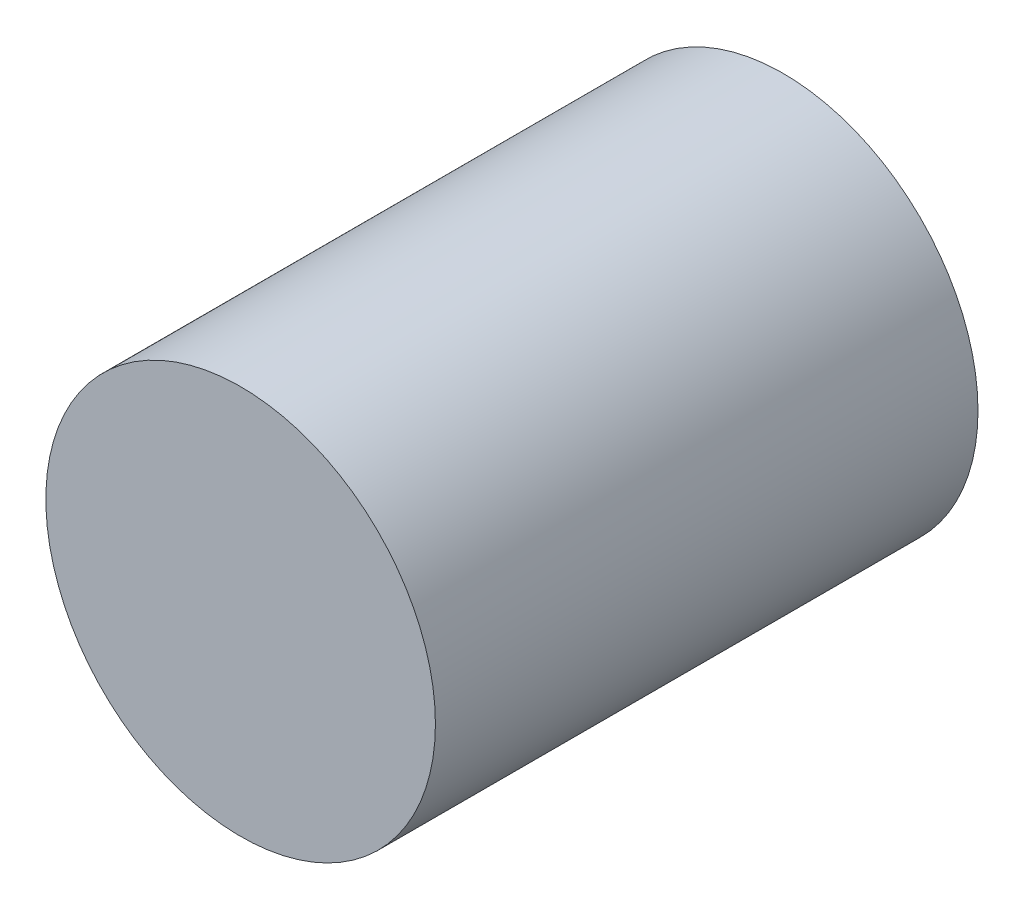
ISO-10303-21;
HEADER;
FILE_DESCRIPTION(('STEP AP214'),'2;1');
FILE_NAME('part.step','',(''),(''),'','','');
FILE_SCHEMA(('AUTOMOTIVE_DESIGN { 1 0 10303 214 1 1 1 1 }'));
ENDSEC;
DATA;
#1=APPLICATION_CONTEXT('core data for automotive mechanical design processes');
#2=APPLICATION_PROTOCOL_DEFINITION('international standard','automotive_design',2000,#1);
#3=PRODUCT_CONTEXT('',#1,'mechanical');
#4=PRODUCT('Part','Part','',(#3));
#5=PRODUCT_RELATED_PRODUCT_CATEGORY('part','',(#4));
#6=PRODUCT_DEFINITION_FORMATION('','',#4);
#7=PRODUCT_DEFINITION_CONTEXT('part definition',#1,'design');
#8=PRODUCT_DEFINITION('design','',#6,#7);
#9=PRODUCT_DEFINITION_SHAPE('','',#8);
#10=(LENGTH_UNIT() NAMED_UNIT(*) SI_UNIT(.MILLI.,.METRE.));
#11=(NAMED_UNIT(*) PLANE_ANGLE_UNIT() SI_UNIT($,.RADIAN.));
#12=(NAMED_UNIT(*) SI_UNIT($,.STERADIAN.) SOLID_ANGLE_UNIT());
#13=UNCERTAINTY_MEASURE_WITH_UNIT(LENGTH_MEASURE(1.E-05),#10,'distance_accuracy_value','');
#14=(GEOMETRIC_REPRESENTATION_CONTEXT(3) GLOBAL_UNCERTAINTY_ASSIGNED_CONTEXT((#13)) GLOBAL_UNIT_ASSIGNED_CONTEXT((#10,
#11,#12)) REPRESENTATION_CONTEXT('',''));
#15=CARTESIAN_POINT('',(0.,0.,0.));
#16=DIRECTION('',(0.,0.,1.));
#17=DIRECTION('',(1.,0.,0.));
#18=AXIS2_PLACEMENT_3D('',#15,#16,#17);
#19=CARTESIAN_POINT('',(0.,0.,20.));
#20=DIRECTION('',(0.,0.,-1.));
#21=DIRECTION('',(-1.,0.,0.));
#22=AXIS2_PLACEMENT_3D('',#19,#20,#21);
#23=CYLINDRICAL_SURFACE('',#22,7.18);
#24=CARTESIAN_POINT('',(0.,0.,20.));
#25=DIRECTION('',(0.,0.,1.));
#26=DIRECTION('',(1.,0.,0.));
#27=AXIS2_PLACEMENT_3D('',#24,#25,#26);
#28=CIRCLE('',#27,7.18);
#29=CARTESIAN_POINT('',(7.18,0.,20.));
#30=VERTEX_POINT('',#29);
#31=EDGE_CURVE('E10',#30,#30,#28,.T.);
#32=ORIENTED_EDGE('',*,*,#31,.F.);
#33=EDGE_LOOP('',(#32));
#34=FACE_BOUND('',#33,.T.);
#35=CARTESIAN_POINT('',(0.,0.,0.));
#36=DIRECTION('',(0.,0.,1.));
#37=DIRECTION('',(1.,0.,0.));
#38=AXIS2_PLACEMENT_3D('',#35,#36,#37);
#39=CIRCLE('',#38,7.18);
#40=CARTESIAN_POINT('',(7.18,0.,0.));
#41=VERTEX_POINT('',#40);
#42=EDGE_CURVE('E37',#41,#41,#39,.T.);
#43=ORIENTED_EDGE('',*,*,#42,.T.);
#44=EDGE_LOOP('',(#43));
#45=FACE_BOUND('',#44,.T.);
#46=ADVANCED_FACE('F40',(#34,#45),#23,.T.);
#47=CARTESIAN_POINT('',(0.,0.,20.));
#48=DIRECTION('',(0.,0.,1.));
#49=DIRECTION('',(1.,0.,0.));
#50=AXIS2_PLACEMENT_3D('',#47,#48,#49);
#51=PLANE('',#50);
#52=ORIENTED_EDGE('',*,*,#31,.T.);
#53=EDGE_LOOP('',(#52));
#54=FACE_BOUND('',#53,.T.);
#55=ADVANCED_FACE('F55',(#54),#51,.T.);
#56=CARTESIAN_POINT('',(0.,0.,0.));
#57=DIRECTION('',(0.,0.,1.));
#58=DIRECTION('',(1.,0.,0.));
#59=AXIS2_PLACEMENT_3D('',#56,#57,#58);
#60=PLANE('',#59);
#61=ORIENTED_EDGE('',*,*,#42,.F.);
#62=EDGE_LOOP('',(#61));
#63=FACE_BOUND('',#62,.T.);
#64=ADVANCED_FACE('F49',(#63),#60,.F.);
#65=CLOSED_SHELL('',(#46,#55,#64));
#66=MANIFOLD_SOLID_BREP('B2',#65);
#67=ADVANCED_BREP_SHAPE_REPRESENTATION('',(#18,#66),#14);
#68=SHAPE_DEFINITION_REPRESENTATION(#9,#67);
ENDSEC;
END-ISO-10303-21;
